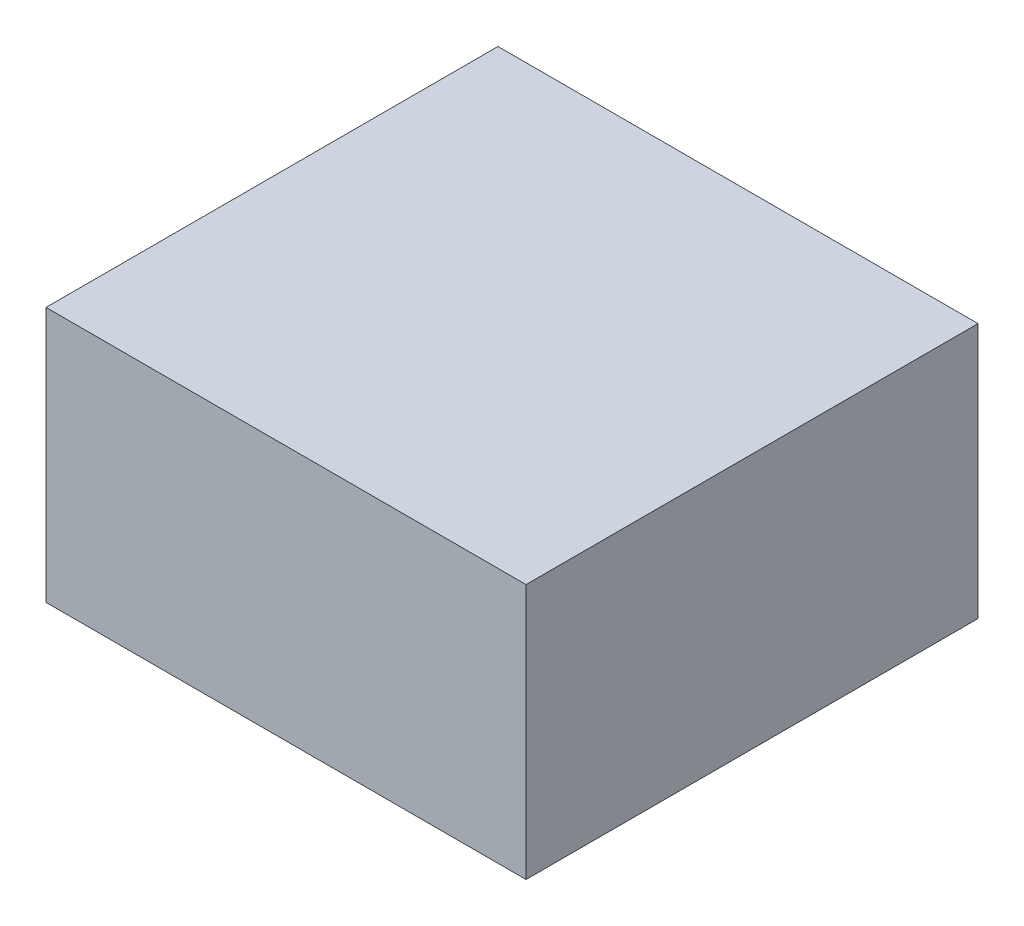
ISO-10303-21;
HEADER;
FILE_DESCRIPTION(('STEP AP214'),'2;1');
FILE_NAME('part.step','',(''),(''),'','','');
FILE_SCHEMA(('AUTOMOTIVE_DESIGN { 1 0 10303 214 1 1 1 1 }'));
ENDSEC;
DATA;
#1=APPLICATION_CONTEXT('core data for automotive mechanical design processes');
#2=APPLICATION_PROTOCOL_DEFINITION('international standard','automotive_design',2000,#1);
#3=PRODUCT_CONTEXT('',#1,'mechanical');
#4=PRODUCT('Part','Part','',(#3));
#5=PRODUCT_RELATED_PRODUCT_CATEGORY('part','',(#4));
#6=PRODUCT_DEFINITION_FORMATION('','',#4);
#7=PRODUCT_DEFINITION_CONTEXT('part definition',#1,'design');
#8=PRODUCT_DEFINITION('design','',#6,#7);
#9=PRODUCT_DEFINITION_SHAPE('','',#8);
#10=(LENGTH_UNIT() NAMED_UNIT(*) SI_UNIT(.MILLI.,.METRE.));
#11=(NAMED_UNIT(*) PLANE_ANGLE_UNIT() SI_UNIT($,.RADIAN.));
#12=(NAMED_UNIT(*) SI_UNIT($,.STERADIAN.) SOLID_ANGLE_UNIT());
#13=UNCERTAINTY_MEASURE_WITH_UNIT(LENGTH_MEASURE(1.E-05),#10,'distance_accuracy_value','');
#14=(GEOMETRIC_REPRESENTATION_CONTEXT(3) GLOBAL_UNCERTAINTY_ASSIGNED_CONTEXT((#13)) GLOBAL_UNIT_ASSIGNED_CONTEXT((#10,
#11,#12)) REPRESENTATION_CONTEXT('',''));
#15=CARTESIAN_POINT('',(0.,0.,0.));
#16=DIRECTION('',(0.,0.,1.));
#17=DIRECTION('',(1.,0.,0.));
#18=AXIS2_PLACEMENT_3D('',#15,#16,#17);
#19=CARTESIAN_POINT('',(0.,91.,0.));
#20=DIRECTION('',(1.,0.,0.));
#21=DIRECTION('',(0.,0.,-1.));
#22=AXIS2_PLACEMENT_3D('',#19,#20,#21);
#23=PLANE('',#22);
#24=DIRECTION('',(0.,0.,1.));
#25=VECTOR('',#24,1.);
#26=CARTESIAN_POINT('',(0.,0.,0.));
#27=LINE('',#26,#25);
#28=CARTESIAN_POINT('',(0.,0.,0.));
#29=VERTEX_POINT('',#28);
#30=CARTESIAN_POINT('',(0.,0.,161.));
#31=VERTEX_POINT('',#30);
#32=EDGE_CURVE('E98',#29,#31,#27,.T.);
#33=ORIENTED_EDGE('',*,*,#32,.T.);
#34=DIRECTION('',(0.,-1.,0.));
#35=VECTOR('',#34,1.);
#36=CARTESIAN_POINT('',(0.,91.,161.));
#37=LINE('',#36,#35);
#38=CARTESIAN_POINT('',(0.,91.,161.));
#39=VERTEX_POINT('',#38);
#40=EDGE_CURVE('E11',#39,#31,#37,.T.);
#41=ORIENTED_EDGE('',*,*,#40,.F.);
#42=DIRECTION('',(0.,0.,1.));
#43=VECTOR('',#42,1.);
#44=CARTESIAN_POINT('',(0.,91.,0.));
#45=LINE('',#44,#43);
#46=CARTESIAN_POINT('',(0.,91.,0.));
#47=VERTEX_POINT('',#46);
#48=EDGE_CURVE('E86',#47,#39,#45,.T.);
#49=ORIENTED_EDGE('',*,*,#48,.F.);
#50=DIRECTION('',(0.,-1.,0.));
#51=VECTOR('',#50,1.);
#52=CARTESIAN_POINT('',(0.,91.,0.));
#53=LINE('',#52,#51);
#54=EDGE_CURVE('E94',#47,#29,#53,.T.);
#55=ORIENTED_EDGE('',*,*,#54,.T.);
#56=EDGE_LOOP('',(#33,#41,#49,#55));
#57=FACE_BOUND('',#56,.T.);
#58=ADVANCED_FACE('F35',(#57),#23,.F.);
#59=CARTESIAN_POINT('',(0.,91.,161.));
#60=DIRECTION('',(0.,0.,-1.));
#61=DIRECTION('',(-1.,0.,0.));
#62=AXIS2_PLACEMENT_3D('',#59,#60,#61);
#63=PLANE('',#62);
#64=DIRECTION('',(1.,0.,0.));
#65=VECTOR('',#64,1.);
#66=CARTESIAN_POINT('',(0.,0.,161.));
#67=LINE('',#66,#65);
#68=CARTESIAN_POINT('',(171.,0.,161.));
#69=VERTEX_POINT('',#68);
#70=EDGE_CURVE('E90',#31,#69,#67,.T.);
#71=ORIENTED_EDGE('',*,*,#70,.T.);
#72=DIRECTION('',(0.,-1.,0.));
#73=VECTOR('',#72,1.);
#74=CARTESIAN_POINT('',(171.,91.,161.));
#75=LINE('',#74,#73);
#76=CARTESIAN_POINT('',(171.,91.,161.));
#77=VERTEX_POINT('',#76);
#78=EDGE_CURVE('E43',#77,#69,#75,.T.);
#79=ORIENTED_EDGE('',*,*,#78,.F.);
#80=DIRECTION('',(1.,0.,0.));
#81=VECTOR('',#80,1.);
#82=CARTESIAN_POINT('',(0.,91.,161.));
#83=LINE('',#82,#81);
#84=EDGE_CURVE('E81',#39,#77,#83,.T.);
#85=ORIENTED_EDGE('',*,*,#84,.F.);
#86=ORIENTED_EDGE('',*,*,#40,.T.);
#87=EDGE_LOOP('',(#71,#79,#85,#86));
#88=FACE_BOUND('',#87,.T.);
#89=ADVANCED_FACE('F89',(#88),#63,.F.);
#90=CARTESIAN_POINT('',(171.,91.,0.));
#91=DIRECTION('',(-1.,0.,0.));
#92=DIRECTION('',(0.,0.,1.));
#93=AXIS2_PLACEMENT_3D('',#90,#91,#92);
#94=PLANE('',#93);
#95=DIRECTION('',(0.,0.,-1.));
#96=VECTOR('',#95,1.);
#97=CARTESIAN_POINT('',(171.,0.,0.));
#98=LINE('',#97,#96);
#99=CARTESIAN_POINT('',(171.,0.,0.));
#100=VERTEX_POINT('',#99);
#101=EDGE_CURVE('E68',#69,#100,#98,.T.);
#102=ORIENTED_EDGE('',*,*,#101,.T.);
#103=DIRECTION('',(0.,-1.,0.));
#104=VECTOR('',#103,1.);
#105=CARTESIAN_POINT('',(171.,91.,0.));
#106=LINE('',#105,#104);
#107=CARTESIAN_POINT('',(171.,91.,0.));
#108=VERTEX_POINT('',#107);
#109=EDGE_CURVE('E91',#108,#100,#106,.T.);
#110=ORIENTED_EDGE('',*,*,#109,.F.);
#111=DIRECTION('',(0.,0.,-1.));
#112=VECTOR('',#111,1.);
#113=CARTESIAN_POINT('',(171.,91.,0.));
#114=LINE('',#113,#112);
#115=EDGE_CURVE('E84',#77,#108,#114,.T.);
#116=ORIENTED_EDGE('',*,*,#115,.F.);
#117=ORIENTED_EDGE('',*,*,#78,.T.);
#118=EDGE_LOOP('',(#102,#110,#116,#117));
#119=FACE_BOUND('',#118,.T.);
#120=ADVANCED_FACE('F92',(#119),#94,.F.);
#121=CARTESIAN_POINT('',(0.,91.,0.));
#122=DIRECTION('',(0.,0.,1.));
#123=DIRECTION('',(1.,0.,0.));
#124=AXIS2_PLACEMENT_3D('',#121,#122,#123);
#125=PLANE('',#124);
#126=DIRECTION('',(-1.,0.,0.));
#127=VECTOR('',#126,1.);
#128=CARTESIAN_POINT('',(0.,0.,0.));
#129=LINE('',#128,#127);
#130=EDGE_CURVE('E74',#100,#29,#129,.T.);
#131=ORIENTED_EDGE('',*,*,#130,.T.);
#132=ORIENTED_EDGE('',*,*,#54,.F.);
#133=DIRECTION('',(-1.,0.,0.));
#134=VECTOR('',#133,1.);
#135=CARTESIAN_POINT('',(0.,91.,0.));
#136=LINE('',#135,#134);
#137=EDGE_CURVE('E51',#108,#47,#136,.T.);
#138=ORIENTED_EDGE('',*,*,#137,.F.);
#139=ORIENTED_EDGE('',*,*,#109,.T.);
#140=EDGE_LOOP('',(#131,#132,#138,#139));
#141=FACE_BOUND('',#140,.T.);
#142=ADVANCED_FACE('F105',(#141),#125,.F.);
#143=CARTESIAN_POINT('',(0.,91.,0.));
#144=DIRECTION('',(0.,1.,0.));
#145=DIRECTION('',(0.,0.,1.));
#146=AXIS2_PLACEMENT_3D('',#143,#144,#145);
#147=PLANE('',#146);
#148=ORIENTED_EDGE('',*,*,#48,.T.);
#149=ORIENTED_EDGE('',*,*,#84,.T.);
#150=ORIENTED_EDGE('',*,*,#115,.T.);
#151=ORIENTED_EDGE('',*,*,#137,.T.);
#152=EDGE_LOOP('',(#148,#149,#150,#151));
#153=FACE_BOUND('',#152,.T.);
#154=ADVANCED_FACE('F82',(#153),#147,.T.);
#155=CARTESIAN_POINT('',(0.,0.,0.));
#156=DIRECTION('',(0.,1.,0.));
#157=DIRECTION('',(0.,0.,1.));
#158=AXIS2_PLACEMENT_3D('',#155,#156,#157);
#159=PLANE('',#158);
#160=ORIENTED_EDGE('',*,*,#32,.F.);
#161=ORIENTED_EDGE('',*,*,#130,.F.);
#162=ORIENTED_EDGE('',*,*,#101,.F.);
#163=ORIENTED_EDGE('',*,*,#70,.F.);
#164=EDGE_LOOP('',(#160,#161,#162,#163));
#165=FACE_BOUND('',#164,.T.);
#166=ADVANCED_FACE('F108',(#165),#159,.F.);
#167=CLOSED_SHELL('',(#58,#89,#120,#142,#154,#166));
#168=MANIFOLD_SOLID_BREP('B2',#167);
#169=ADVANCED_BREP_SHAPE_REPRESENTATION('',(#18,#168),#14);
#170=SHAPE_DEFINITION_REPRESENTATION(#9,#169);
ENDSEC;
END-ISO-10303-21;
